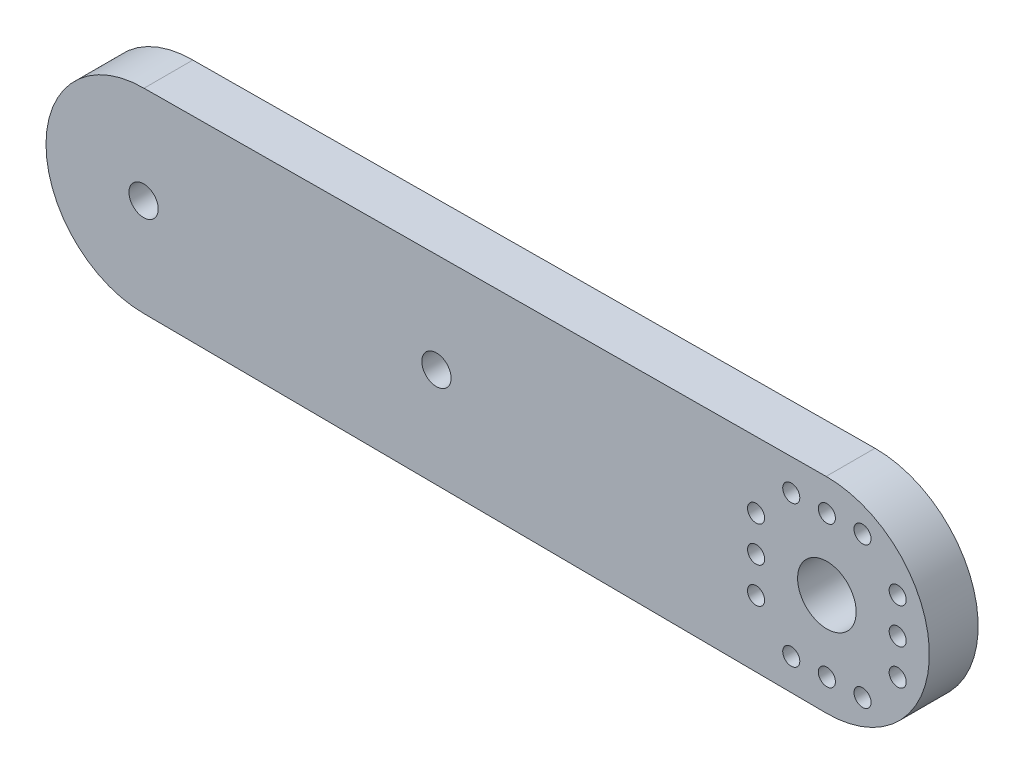
ISO-10303-21;
HEADER;
FILE_DESCRIPTION(('STEP AP214'),'2;1');
FILE_NAME('part.step','',(''),(''),'','','');
FILE_SCHEMA(('AUTOMOTIVE_DESIGN { 1 0 10303 214 1 1 1 1 }'));
ENDSEC;
DATA;
#1=APPLICATION_CONTEXT('core data for automotive mechanical design processes');
#2=APPLICATION_PROTOCOL_DEFINITION('international standard','automotive_design',2000,#1);
#3=PRODUCT_CONTEXT('',#1,'mechanical');
#4=PRODUCT('Part','Part','',(#3));
#5=PRODUCT_RELATED_PRODUCT_CATEGORY('part','',(#4));
#6=PRODUCT_DEFINITION_FORMATION('','',#4);
#7=PRODUCT_DEFINITION_CONTEXT('part definition',#1,'design');
#8=PRODUCT_DEFINITION('design','',#6,#7);
#9=PRODUCT_DEFINITION_SHAPE('','',#8);
#10=(LENGTH_UNIT() NAMED_UNIT(*) SI_UNIT(.MILLI.,.METRE.));
#11=(NAMED_UNIT(*) PLANE_ANGLE_UNIT() SI_UNIT($,.RADIAN.));
#12=(NAMED_UNIT(*) SI_UNIT($,.STERADIAN.) SOLID_ANGLE_UNIT());
#13=UNCERTAINTY_MEASURE_WITH_UNIT(LENGTH_MEASURE(1.E-05),#10,'distance_accuracy_value','');
#14=(GEOMETRIC_REPRESENTATION_CONTEXT(3) GLOBAL_UNCERTAINTY_ASSIGNED_CONTEXT((#13)) GLOBAL_UNIT_ASSIGNED_CONTEXT((#10,
#11,#12)) REPRESENTATION_CONTEXT('',''));
#15=CARTESIAN_POINT('',(0.,0.,0.));
#16=DIRECTION('',(0.,0.,1.));
#17=DIRECTION('',(1.,0.,0.));
#18=AXIS2_PLACEMENT_3D('',#15,#16,#17);
#19=CARTESIAN_POINT('',(-70.,0.,5.));
#20=DIRECTION('',(0.,0.,1.));
#21=DIRECTION('',(1.,0.,0.));
#22=AXIS2_PLACEMENT_3D('',#19,#20,#21);
#23=PLANE('',#22);
#24=CARTESIAN_POINT('',(-40.,0.,5.));
#25=DIRECTION('',(0.,0.,1.));
#26=DIRECTION('',(1.,0.,0.));
#27=AXIS2_PLACEMENT_3D('',#24,#25,#26);
#28=CIRCLE('',#27,1.5);
#29=CARTESIAN_POINT('',(-38.5,0.,5.));
#30=VERTEX_POINT('',#29);
#31=EDGE_CURVE('E188',#30,#30,#28,.T.);
#32=ORIENTED_EDGE('',*,*,#31,.F.);
#33=EDGE_LOOP('',(#32));
#34=FACE_BOUND('',#33,.T.);
#35=CARTESIAN_POINT('',(1.00571845041749E-13,7.2544999999999,5.));
#36=DIRECTION('',(0.,0.,1.));
#37=DIRECTION('',(1.,0.,0.));
#38=AXIS2_PLACEMENT_3D('',#35,#36,#37);
#39=CIRCLE('',#38,0.875000000000108);
#40=CARTESIAN_POINT('',(0.875000000000208,7.2544999999999,5.));
#41=VERTEX_POINT('',#40);
#42=EDGE_CURVE('E176',#41,#41,#39,.T.);
#43=ORIENTED_EDGE('',*,*,#42,.F.);
#44=EDGE_LOOP('',(#43));
#45=FACE_BOUND('',#44,.T.);
#46=CARTESIAN_POINT('',(-7.2544999999998,3.65,5.));
#47=DIRECTION('',(0.,0.,1.));
#48=DIRECTION('',(-1.,0.,0.));
#49=AXIS2_PLACEMENT_3D('',#46,#47,#48);
#50=CIRCLE('',#49,0.875000000000177);
#51=CARTESIAN_POINT('',(-8.12949999999997,3.65,5.));
#52=VERTEX_POINT('',#51);
#53=EDGE_CURVE('E164',#52,#52,#50,.T.);
#54=ORIENTED_EDGE('',*,*,#53,.F.);
#55=EDGE_LOOP('',(#54));
#56=FACE_BOUND('',#55,.T.);
#57=CARTESIAN_POINT('',(-7.2544999999998,-3.65,5.));
#58=DIRECTION('',(0.,0.,1.));
#59=DIRECTION('',(1.,0.,0.));
#60=AXIS2_PLACEMENT_3D('',#57,#58,#59);
#61=CIRCLE('',#60,0.875000000000204);
#62=CARTESIAN_POINT('',(-6.37949999999959,-3.65,5.));
#63=VERTEX_POINT('',#62);
#64=EDGE_CURVE('E152',#63,#63,#61,.T.);
#65=ORIENTED_EDGE('',*,*,#64,.F.);
#66=EDGE_LOOP('',(#65));
#67=FACE_BOUND('',#66,.T.);
#68=CARTESIAN_POINT('',(1.03237105103073E-13,-7.2544999999999,5.));
#69=DIRECTION('',(0.,0.,1.));
#70=DIRECTION('',(1.,0.,0.));
#71=AXIS2_PLACEMENT_3D('',#68,#69,#70);
#72=CIRCLE('',#71,0.87500000000006);
#73=CARTESIAN_POINT('',(0.875000000000164,-7.2544999999999,5.));
#74=VERTEX_POINT('',#73);
#75=EDGE_CURVE('E140',#74,#74,#72,.T.);
#76=ORIENTED_EDGE('',*,*,#75,.F.);
#77=EDGE_LOOP('',(#76));
#78=FACE_BOUND('',#77,.T.);
#79=CARTESIAN_POINT('',(7.2545,-3.65,5.));
#80=DIRECTION('',(0.,0.,1.));
#81=DIRECTION('',(-1.,0.,0.));
#82=AXIS2_PLACEMENT_3D('',#79,#80,#81);
#83=CIRCLE('',#82,0.874999999999995);
#84=CARTESIAN_POINT('',(6.3795,-3.65,5.));
#85=VERTEX_POINT('',#84);
#86=EDGE_CURVE('E128',#85,#85,#83,.T.);
#87=ORIENTED_EDGE('',*,*,#86,.F.);
#88=EDGE_LOOP('',(#87));
#89=FACE_BOUND('',#88,.T.);
#90=CARTESIAN_POINT('',(7.2545,3.65,5.));
#91=DIRECTION('',(0.,0.,1.));
#92=DIRECTION('',(1.,0.,0.));
#93=AXIS2_PLACEMENT_3D('',#90,#91,#92);
#94=CIRCLE('',#93,0.874999999999998);
#95=CARTESIAN_POINT('',(8.1295,3.65,5.));
#96=VERTEX_POINT('',#95);
#97=EDGE_CURVE('E116',#96,#96,#94,.T.);
#98=ORIENTED_EDGE('',*,*,#97,.F.);
#99=EDGE_LOOP('',(#98));
#100=FACE_BOUND('',#99,.T.);
#101=CARTESIAN_POINT('',(-70.,0.,5.));
#102=DIRECTION('',(0.,0.,1.));
#103=DIRECTION('',(1.,0.,0.));
#104=AXIS2_PLACEMENT_3D('',#101,#102,#103);
#105=CIRCLE('',#104,10.);
#106=CARTESIAN_POINT('',(-69.9571642528192,9.9999082545173,5.));
#107=VERTEX_POINT('',#106);
#108=CARTESIAN_POINT('',(-70.,-10.,5.));
#109=VERTEX_POINT('',#108);
#110=EDGE_CURVE('E86',#107,#109,#105,.T.);
#111=ORIENTED_EDGE('',*,*,#110,.T.);
#112=DIRECTION('',(0.999974463405456,-0.00714650522779189,0.));
#113=VECTOR('',#112,1.);
#114=CARTESIAN_POINT('',(-70.,-10.,5.));
#115=LINE('',#114,#113);
#116=CARTESIAN_POINT('',(-0.0750383048918187,-10.4997318657573,5.));
#117=VERTEX_POINT('',#116);
#118=EDGE_CURVE('E81',#109,#117,#115,.T.);
#119=ORIENTED_EDGE('',*,*,#118,.T.);
#120=CARTESIAN_POINT('',(0.,0.,5.));
#121=DIRECTION('',(0.,0.,1.));
#122=DIRECTION('',(1.,0.,0.));
#123=AXIS2_PLACEMENT_3D('',#120,#121,#122);
#124=CIRCLE('',#123,10.5);
#125=CARTESIAN_POINT('',(-0.0750980828813749,10.4997314383725,5.));
#126=VERTEX_POINT('',#125);
#127=EDGE_CURVE('E84',#117,#126,#124,.T.);
#128=ORIENTED_EDGE('',*,*,#127,.T.);
#129=DIRECTION('',(-0.999974422702141,-0.00715219836965465,0.));
#130=VECTOR('',#129,1.);
#131=CARTESIAN_POINT('',(-69.9571642528192,9.9999082545173,5.));
#132=LINE('',#131,#130);
#133=EDGE_CURVE('E51',#126,#107,#132,.T.);
#134=ORIENTED_EDGE('',*,*,#133,.T.);
#135=EDGE_LOOP('',(#111,#119,#128,#134));
#136=FACE_BOUND('',#135,.T.);
#137=CARTESIAN_POINT('',(-70.,0.,5.));
#138=DIRECTION('',(0.,0.,1.));
#139=DIRECTION('',(1.,0.,0.));
#140=AXIS2_PLACEMENT_3D('',#137,#138,#139);
#141=CIRCLE('',#140,1.5);
#142=CARTESIAN_POINT('',(-68.5,0.,5.));
#143=VERTEX_POINT('',#142);
#144=EDGE_CURVE('E101',#143,#143,#141,.T.);
#145=ORIENTED_EDGE('',*,*,#144,.F.);
#146=EDGE_LOOP('',(#145));
#147=FACE_BOUND('',#146,.T.);
#148=CARTESIAN_POINT('',(7.2545,0.,5.));
#149=DIRECTION('',(0.,0.,1.));
#150=DIRECTION('',(1.,0.,0.));
#151=AXIS2_PLACEMENT_3D('',#148,#149,#150);
#152=CIRCLE('',#151,0.875);
#153=CARTESIAN_POINT('',(8.1295,0.,5.));
#154=VERTEX_POINT('',#153);
#155=EDGE_CURVE('E122',#154,#154,#152,.T.);
#156=ORIENTED_EDGE('',*,*,#155,.F.);
#157=EDGE_LOOP('',(#156));
#158=FACE_BOUND('',#157,.T.);
#159=CARTESIAN_POINT('',(3.6500000000001,-7.2544999999999,5.));
#160=DIRECTION('',(0.,0.,1.));
#161=DIRECTION('',(1.,0.,0.));
#162=AXIS2_PLACEMENT_3D('',#159,#160,#161);
#163=CIRCLE('',#162,0.875000000000071);
#164=CARTESIAN_POINT('',(4.52500000000017,-7.2544999999999,5.));
#165=VERTEX_POINT('',#164);
#166=EDGE_CURVE('E134',#165,#165,#163,.T.);
#167=ORIENTED_EDGE('',*,*,#166,.F.);
#168=EDGE_LOOP('',(#167));
#169=FACE_BOUND('',#168,.T.);
#170=CARTESIAN_POINT('',(-3.6499999999999,-7.2544999999999,5.));
#171=DIRECTION('',(0.,0.,1.));
#172=DIRECTION('',(-1.,0.,0.));
#173=AXIS2_PLACEMENT_3D('',#170,#171,#172);
#174=CIRCLE('',#173,0.875000000000114);
#175=CARTESIAN_POINT('',(-4.52500000000001,-7.2544999999999,5.));
#176=VERTEX_POINT('',#175);
#177=EDGE_CURVE('E146',#176,#176,#174,.T.);
#178=ORIENTED_EDGE('',*,*,#177,.F.);
#179=EDGE_LOOP('',(#178));
#180=FACE_BOUND('',#179,.T.);
#181=CARTESIAN_POINT('',(-7.2544999999998,0.,5.));
#182=DIRECTION('',(0.,0.,1.));
#183=DIRECTION('',(1.,0.,0.));
#184=AXIS2_PLACEMENT_3D('',#181,#182,#183);
#185=CIRCLE('',#184,0.875000000000181);
#186=CARTESIAN_POINT('',(-6.37949999999961,0.,5.));
#187=VERTEX_POINT('',#186);
#188=EDGE_CURVE('E158',#187,#187,#185,.T.);
#189=ORIENTED_EDGE('',*,*,#188,.F.);
#190=EDGE_LOOP('',(#189));
#191=FACE_BOUND('',#190,.T.);
#192=CARTESIAN_POINT('',(-3.6499999999999,7.2544999999999,5.));
#193=DIRECTION('',(0.,0.,1.));
#194=DIRECTION('',(1.,0.,0.));
#195=AXIS2_PLACEMENT_3D('',#192,#193,#194);
#196=CIRCLE('',#195,0.875000000000142);
#197=CARTESIAN_POINT('',(-2.77499999999976,7.2544999999999,5.));
#198=VERTEX_POINT('',#197);
#199=EDGE_CURVE('E170',#198,#198,#196,.T.);
#200=ORIENTED_EDGE('',*,*,#199,.F.);
#201=EDGE_LOOP('',(#200));
#202=FACE_BOUND('',#201,.T.);
#203=CARTESIAN_POINT('',(3.6500000000001,7.2544999999999,5.));
#204=DIRECTION('',(0.,0.,1.));
#205=DIRECTION('',(-1.,0.,0.));
#206=AXIS2_PLACEMENT_3D('',#203,#204,#205);
#207=CIRCLE('',#206,0.875000000000044);
#208=CARTESIAN_POINT('',(2.77500000000006,7.2544999999999,5.));
#209=VERTEX_POINT('',#208);
#210=EDGE_CURVE('E182',#209,#209,#207,.T.);
#211=ORIENTED_EDGE('',*,*,#210,.F.);
#212=EDGE_LOOP('',(#211));
#213=FACE_BOUND('',#212,.T.);
#214=CARTESIAN_POINT('',(0.,0.,5.));
#215=DIRECTION('',(0.,0.,1.));
#216=DIRECTION('',(1.,0.,0.));
#217=AXIS2_PLACEMENT_3D('',#214,#215,#216);
#218=CIRCLE('',#217,3.);
#219=CARTESIAN_POINT('',(3.,0.,5.));
#220=VERTEX_POINT('',#219);
#221=EDGE_CURVE('E194',#220,#220,#218,.T.);
#222=ORIENTED_EDGE('',*,*,#221,.F.);
#223=EDGE_LOOP('',(#222));
#224=FACE_BOUND('',#223,.T.);
#225=ADVANCED_FACE('F34',(#34,#45,#56,#67,#78,#89,#100,#136,#147,#158,#169,#180,#191,#202,#213,
#224),#23,.T.);
#226=CARTESIAN_POINT('',(-70.,0.,0.));
#227=DIRECTION('',(0.,0.,1.));
#228=DIRECTION('',(1.,0.,0.));
#229=AXIS2_PLACEMENT_3D('',#226,#227,#228);
#230=PLANE('',#229);
#231=CARTESIAN_POINT('',(-40.,0.,0.));
#232=DIRECTION('',(0.,0.,1.));
#233=DIRECTION('',(1.,0.,0.));
#234=AXIS2_PLACEMENT_3D('',#231,#232,#233);
#235=CIRCLE('',#234,1.5);
#236=CARTESIAN_POINT('',(-38.5,0.,0.));
#237=VERTEX_POINT('',#236);
#238=EDGE_CURVE('E191',#237,#237,#235,.T.);
#239=ORIENTED_EDGE('',*,*,#238,.T.);
#240=EDGE_LOOP('',(#239));
#241=FACE_BOUND('',#240,.T.);
#242=CARTESIAN_POINT('',(1.00571845041749E-13,7.2544999999999,0.));
#243=DIRECTION('',(0.,0.,1.));
#244=DIRECTION('',(1.,0.,0.));
#245=AXIS2_PLACEMENT_3D('',#242,#243,#244);
#246=CIRCLE('',#245,0.875000000000108);
#247=CARTESIAN_POINT('',(0.875000000000208,7.2544999999999,0.));
#248=VERTEX_POINT('',#247);
#249=EDGE_CURVE('E179',#248,#248,#246,.T.);
#250=ORIENTED_EDGE('',*,*,#249,.T.);
#251=EDGE_LOOP('',(#250));
#252=FACE_BOUND('',#251,.T.);
#253=CARTESIAN_POINT('',(-7.2544999999998,3.65,0.));
#254=DIRECTION('',(0.,0.,1.));
#255=DIRECTION('',(-1.,0.,0.));
#256=AXIS2_PLACEMENT_3D('',#253,#254,#255);
#257=CIRCLE('',#256,0.875000000000177);
#258=CARTESIAN_POINT('',(-8.12949999999997,3.65,0.));
#259=VERTEX_POINT('',#258);
#260=EDGE_CURVE('E167',#259,#259,#257,.T.);
#261=ORIENTED_EDGE('',*,*,#260,.T.);
#262=EDGE_LOOP('',(#261));
#263=FACE_BOUND('',#262,.T.);
#264=CARTESIAN_POINT('',(-7.2544999999998,-3.65,0.));
#265=DIRECTION('',(0.,0.,1.));
#266=DIRECTION('',(1.,0.,0.));
#267=AXIS2_PLACEMENT_3D('',#264,#265,#266);
#268=CIRCLE('',#267,0.875000000000204);
#269=CARTESIAN_POINT('',(-6.37949999999959,-3.65,0.));
#270=VERTEX_POINT('',#269);
#271=EDGE_CURVE('E155',#270,#270,#268,.T.);
#272=ORIENTED_EDGE('',*,*,#271,.T.);
#273=EDGE_LOOP('',(#272));
#274=FACE_BOUND('',#273,.T.);
#275=CARTESIAN_POINT('',(1.03237105103073E-13,-7.2544999999999,0.));
#276=DIRECTION('',(0.,0.,1.));
#277=DIRECTION('',(1.,0.,0.));
#278=AXIS2_PLACEMENT_3D('',#275,#276,#277);
#279=CIRCLE('',#278,0.87500000000006);
#280=CARTESIAN_POINT('',(0.875000000000164,-7.2544999999999,0.));
#281=VERTEX_POINT('',#280);
#282=EDGE_CURVE('E143',#281,#281,#279,.T.);
#283=ORIENTED_EDGE('',*,*,#282,.T.);
#284=EDGE_LOOP('',(#283));
#285=FACE_BOUND('',#284,.T.);
#286=CARTESIAN_POINT('',(7.2545,-3.65,0.));
#287=DIRECTION('',(0.,0.,1.));
#288=DIRECTION('',(-1.,0.,0.));
#289=AXIS2_PLACEMENT_3D('',#286,#287,#288);
#290=CIRCLE('',#289,0.874999999999995);
#291=CARTESIAN_POINT('',(6.3795,-3.65,0.));
#292=VERTEX_POINT('',#291);
#293=EDGE_CURVE('E131',#292,#292,#290,.T.);
#294=ORIENTED_EDGE('',*,*,#293,.T.);
#295=EDGE_LOOP('',(#294));
#296=FACE_BOUND('',#295,.T.);
#297=CARTESIAN_POINT('',(7.2545,3.65,0.));
#298=DIRECTION('',(0.,0.,1.));
#299=DIRECTION('',(1.,0.,0.));
#300=AXIS2_PLACEMENT_3D('',#297,#298,#299);
#301=CIRCLE('',#300,0.874999999999998);
#302=CARTESIAN_POINT('',(8.1295,3.65,0.));
#303=VERTEX_POINT('',#302);
#304=EDGE_CURVE('E119',#303,#303,#301,.T.);
#305=ORIENTED_EDGE('',*,*,#304,.T.);
#306=EDGE_LOOP('',(#305));
#307=FACE_BOUND('',#306,.T.);
#308=CARTESIAN_POINT('',(-70.,0.,0.));
#309=DIRECTION('',(0.,0.,1.));
#310=DIRECTION('',(1.,0.,0.));
#311=AXIS2_PLACEMENT_3D('',#308,#309,#310);
#312=CIRCLE('',#311,10.);
#313=CARTESIAN_POINT('',(-69.9571642528192,9.9999082545173,0.));
#314=VERTEX_POINT('',#313);
#315=CARTESIAN_POINT('',(-70.,-10.,0.));
#316=VERTEX_POINT('',#315);
#317=EDGE_CURVE('E98',#314,#316,#312,.T.);
#318=ORIENTED_EDGE('',*,*,#317,.F.);
#319=DIRECTION('',(-0.999974422702141,-0.00715219836965465,0.));
#320=VECTOR('',#319,1.);
#321=CARTESIAN_POINT('',(-69.9571642528192,9.9999082545173,0.));
#322=LINE('',#321,#320);
#323=CARTESIAN_POINT('',(-0.0750980828813749,10.4997314383725,0.));
#324=VERTEX_POINT('',#323);
#325=EDGE_CURVE('E74',#324,#314,#322,.T.);
#326=ORIENTED_EDGE('',*,*,#325,.F.);
#327=CARTESIAN_POINT('',(0.,0.,0.));
#328=DIRECTION('',(0.,0.,1.));
#329=DIRECTION('',(1.,0.,0.));
#330=AXIS2_PLACEMENT_3D('',#327,#328,#329);
#331=CIRCLE('',#330,10.5);
#332=CARTESIAN_POINT('',(-0.0750383048918187,-10.4997318657573,0.));
#333=VERTEX_POINT('',#332);
#334=EDGE_CURVE('E68',#333,#324,#331,.T.);
#335=ORIENTED_EDGE('',*,*,#334,.F.);
#336=DIRECTION('',(0.999974463405456,-0.00714650522779189,0.));
#337=VECTOR('',#336,1.);
#338=CARTESIAN_POINT('',(-70.,-10.,0.));
#339=LINE('',#338,#337);
#340=EDGE_CURVE('E90',#316,#333,#339,.T.);
#341=ORIENTED_EDGE('',*,*,#340,.F.);
#342=EDGE_LOOP('',(#318,#326,#335,#341));
#343=FACE_BOUND('',#342,.T.);
#344=CARTESIAN_POINT('',(-70.,0.,0.));
#345=DIRECTION('',(0.,0.,1.));
#346=DIRECTION('',(1.,0.,0.));
#347=AXIS2_PLACEMENT_3D('',#344,#345,#346);
#348=CIRCLE('',#347,1.5);
#349=CARTESIAN_POINT('',(-68.5,0.,0.));
#350=VERTEX_POINT('',#349);
#351=EDGE_CURVE('E113',#350,#350,#348,.T.);
#352=ORIENTED_EDGE('',*,*,#351,.T.);
#353=EDGE_LOOP('',(#352));
#354=FACE_BOUND('',#353,.T.);
#355=CARTESIAN_POINT('',(7.2545,0.,0.));
#356=DIRECTION('',(0.,0.,1.));
#357=DIRECTION('',(1.,0.,0.));
#358=AXIS2_PLACEMENT_3D('',#355,#356,#357);
#359=CIRCLE('',#358,0.875);
#360=CARTESIAN_POINT('',(8.1295,0.,0.));
#361=VERTEX_POINT('',#360);
#362=EDGE_CURVE('E125',#361,#361,#359,.T.);
#363=ORIENTED_EDGE('',*,*,#362,.T.);
#364=EDGE_LOOP('',(#363));
#365=FACE_BOUND('',#364,.T.);
#366=CARTESIAN_POINT('',(3.6500000000001,-7.2544999999999,0.));
#367=DIRECTION('',(0.,0.,1.));
#368=DIRECTION('',(1.,0.,0.));
#369=AXIS2_PLACEMENT_3D('',#366,#367,#368);
#370=CIRCLE('',#369,0.875000000000071);
#371=CARTESIAN_POINT('',(4.52500000000017,-7.2544999999999,0.));
#372=VERTEX_POINT('',#371);
#373=EDGE_CURVE('E137',#372,#372,#370,.T.);
#374=ORIENTED_EDGE('',*,*,#373,.T.);
#375=EDGE_LOOP('',(#374));
#376=FACE_BOUND('',#375,.T.);
#377=CARTESIAN_POINT('',(-3.6499999999999,-7.2544999999999,0.));
#378=DIRECTION('',(0.,0.,1.));
#379=DIRECTION('',(-1.,0.,0.));
#380=AXIS2_PLACEMENT_3D('',#377,#378,#379);
#381=CIRCLE('',#380,0.875000000000114);
#382=CARTESIAN_POINT('',(-4.52500000000001,-7.2544999999999,0.));
#383=VERTEX_POINT('',#382);
#384=EDGE_CURVE('E149',#383,#383,#381,.T.);
#385=ORIENTED_EDGE('',*,*,#384,.T.);
#386=EDGE_LOOP('',(#385));
#387=FACE_BOUND('',#386,.T.);
#388=CARTESIAN_POINT('',(-7.2544999999998,0.,0.));
#389=DIRECTION('',(0.,0.,1.));
#390=DIRECTION('',(1.,0.,0.));
#391=AXIS2_PLACEMENT_3D('',#388,#389,#390);
#392=CIRCLE('',#391,0.875000000000181);
#393=CARTESIAN_POINT('',(-6.37949999999961,0.,0.));
#394=VERTEX_POINT('',#393);
#395=EDGE_CURVE('E161',#394,#394,#392,.T.);
#396=ORIENTED_EDGE('',*,*,#395,.T.);
#397=EDGE_LOOP('',(#396));
#398=FACE_BOUND('',#397,.T.);
#399=CARTESIAN_POINT('',(-3.6499999999999,7.2544999999999,0.));
#400=DIRECTION('',(0.,0.,1.));
#401=DIRECTION('',(1.,0.,0.));
#402=AXIS2_PLACEMENT_3D('',#399,#400,#401);
#403=CIRCLE('',#402,0.875000000000142);
#404=CARTESIAN_POINT('',(-2.77499999999976,7.2544999999999,0.));
#405=VERTEX_POINT('',#404);
#406=EDGE_CURVE('E173',#405,#405,#403,.T.);
#407=ORIENTED_EDGE('',*,*,#406,.T.);
#408=EDGE_LOOP('',(#407));
#409=FACE_BOUND('',#408,.T.);
#410=CARTESIAN_POINT('',(3.6500000000001,7.2544999999999,0.));
#411=DIRECTION('',(0.,0.,1.));
#412=DIRECTION('',(-1.,0.,0.));
#413=AXIS2_PLACEMENT_3D('',#410,#411,#412);
#414=CIRCLE('',#413,0.875000000000044);
#415=CARTESIAN_POINT('',(2.77500000000006,7.2544999999999,0.));
#416=VERTEX_POINT('',#415);
#417=EDGE_CURVE('E185',#416,#416,#414,.T.);
#418=ORIENTED_EDGE('',*,*,#417,.T.);
#419=EDGE_LOOP('',(#418));
#420=FACE_BOUND('',#419,.T.);
#421=CARTESIAN_POINT('',(0.,0.,0.));
#422=DIRECTION('',(0.,0.,1.));
#423=DIRECTION('',(1.,0.,0.));
#424=AXIS2_PLACEMENT_3D('',#421,#422,#423);
#425=CIRCLE('',#424,3.);
#426=CARTESIAN_POINT('',(3.,0.,0.));
#427=VERTEX_POINT('',#426);
#428=EDGE_CURVE('E197',#427,#427,#425,.T.);
#429=ORIENTED_EDGE('',*,*,#428,.T.);
#430=EDGE_LOOP('',(#429));
#431=FACE_BOUND('',#430,.T.);
#432=ADVANCED_FACE('F109',(#241,#252,#263,#274,#285,#296,#307,#343,#354,#365,#376,#387,#398,
#409,#420,#431),#230,.F.);
#433=CARTESIAN_POINT('',(-70.,0.,5.));
#434=DIRECTION('',(0.,0.,-1.));
#435=DIRECTION('',(-1.,0.,0.));
#436=AXIS2_PLACEMENT_3D('',#433,#434,#435);
#437=CYLINDRICAL_SURFACE('',#436,10.);
#438=ORIENTED_EDGE('',*,*,#317,.T.);
#439=DIRECTION('',(0.,0.,-1.));
#440=VECTOR('',#439,1.);
#441=CARTESIAN_POINT('',(-70.,-10.,5.));
#442=LINE('',#441,#440);
#443=EDGE_CURVE('E11',#109,#316,#442,.T.);
#444=ORIENTED_EDGE('',*,*,#443,.F.);
#445=ORIENTED_EDGE('',*,*,#110,.F.);
#446=DIRECTION('',(0.,0.,-1.));
#447=VECTOR('',#446,1.);
#448=CARTESIAN_POINT('',(-69.9571642528192,9.9999082545173,5.));
#449=LINE('',#448,#447);
#450=EDGE_CURVE('E94',#107,#314,#449,.T.);
#451=ORIENTED_EDGE('',*,*,#450,.T.);
#452=EDGE_LOOP('',(#438,#444,#445,#451));
#453=FACE_BOUND('',#452,.T.);
#454=ADVANCED_FACE('F36',(#453),#437,.T.);
#455=CARTESIAN_POINT('',(-70.,-10.,5.));
#456=DIRECTION('',(0.00714650522779189,0.999974463405456,0.));
#457=DIRECTION('',(-0.999974463405456,0.00714650522779189,0.));
#458=AXIS2_PLACEMENT_3D('',#455,#456,#457);
#459=PLANE('',#458);
#460=ORIENTED_EDGE('',*,*,#340,.T.);
#461=DIRECTION('',(0.,0.,-1.));
#462=VECTOR('',#461,1.);
#463=CARTESIAN_POINT('',(-0.0750383048918187,-10.4997318657573,5.));
#464=LINE('',#463,#462);
#465=EDGE_CURVE('E43',#117,#333,#464,.T.);
#466=ORIENTED_EDGE('',*,*,#465,.F.);
#467=ORIENTED_EDGE('',*,*,#118,.F.);
#468=ORIENTED_EDGE('',*,*,#443,.T.);
#469=EDGE_LOOP('',(#460,#466,#467,#468));
#470=FACE_BOUND('',#469,.T.);
#471=ADVANCED_FACE('F89',(#470),#459,.F.);
#472=CARTESIAN_POINT('',(0.,0.,5.));
#473=DIRECTION('',(0.,0.,-1.));
#474=DIRECTION('',(-1.,0.,0.));
#475=AXIS2_PLACEMENT_3D('',#472,#473,#474);
#476=CYLINDRICAL_SURFACE('',#475,10.5);
#477=ORIENTED_EDGE('',*,*,#334,.T.);
#478=DIRECTION('',(0.,0.,-1.));
#479=VECTOR('',#478,1.);
#480=CARTESIAN_POINT('',(-0.0750980828813749,10.4997314383725,5.));
#481=LINE('',#480,#479);
#482=EDGE_CURVE('E91',#126,#324,#481,.T.);
#483=ORIENTED_EDGE('',*,*,#482,.F.);
#484=ORIENTED_EDGE('',*,*,#127,.F.);
#485=ORIENTED_EDGE('',*,*,#465,.T.);
#486=EDGE_LOOP('',(#477,#483,#484,#485));
#487=FACE_BOUND('',#486,.T.);
#488=ADVANCED_FACE('F92',(#487),#476,.T.);
#489=CARTESIAN_POINT('',(-69.9571642528192,9.9999082545173,5.));
#490=DIRECTION('',(0.00715219836965465,-0.999974422702142,0.));
#491=DIRECTION('',(0.999974422702142,0.00715219836965465,0.));
#492=AXIS2_PLACEMENT_3D('',#489,#490,#491);
#493=PLANE('',#492);
#494=ORIENTED_EDGE('',*,*,#325,.T.);
#495=ORIENTED_EDGE('',*,*,#450,.F.);
#496=ORIENTED_EDGE('',*,*,#133,.F.);
#497=ORIENTED_EDGE('',*,*,#482,.T.);
#498=EDGE_LOOP('',(#494,#495,#496,#497));
#499=FACE_BOUND('',#498,.T.);
#500=ADVANCED_FACE('F106',(#499),#493,.F.);
#501=CARTESIAN_POINT('',(-70.,0.,5.));
#502=DIRECTION('',(0.,0.,-1.));
#503=DIRECTION('',(-1.,0.,0.));
#504=AXIS2_PLACEMENT_3D('',#501,#502,#503);
#505=CYLINDRICAL_SURFACE('',#504,1.5);
#506=ORIENTED_EDGE('',*,*,#144,.T.);
#507=EDGE_LOOP('',(#506));
#508=FACE_BOUND('',#507,.T.);
#509=ORIENTED_EDGE('',*,*,#351,.F.);
#510=EDGE_LOOP('',(#509));
#511=FACE_BOUND('',#510,.T.);
#512=ADVANCED_FACE('F217',(#508,#511),#505,.F.);
#513=CARTESIAN_POINT('',(7.2545,3.65,5.));
#514=DIRECTION('',(0.,0.,-1.));
#515=DIRECTION('',(-1.,0.,0.));
#516=AXIS2_PLACEMENT_3D('',#513,#514,#515);
#517=CYLINDRICAL_SURFACE('',#516,0.874999999999998);
#518=ORIENTED_EDGE('',*,*,#97,.T.);
#519=EDGE_LOOP('',(#518));
#520=FACE_BOUND('',#519,.T.);
#521=ORIENTED_EDGE('',*,*,#304,.F.);
#522=EDGE_LOOP('',(#521));
#523=FACE_BOUND('',#522,.T.);
#524=ADVANCED_FACE('F264',(#520,#523),#517,.F.);
#525=CARTESIAN_POINT('',(7.2545,0.,5.));
#526=DIRECTION('',(0.,0.,-1.));
#527=DIRECTION('',(-1.,0.,0.));
#528=AXIS2_PLACEMENT_3D('',#525,#526,#527);
#529=CYLINDRICAL_SURFACE('',#528,0.875);
#530=ORIENTED_EDGE('',*,*,#155,.T.);
#531=EDGE_LOOP('',(#530));
#532=FACE_BOUND('',#531,.T.);
#533=ORIENTED_EDGE('',*,*,#362,.F.);
#534=EDGE_LOOP('',(#533));
#535=FACE_BOUND('',#534,.T.);
#536=ADVANCED_FACE('F273',(#532,#535),#529,.F.);
#537=CARTESIAN_POINT('',(7.2545,-3.65,5.));
#538=DIRECTION('',(0.,0.,-1.));
#539=DIRECTION('',(-1.,0.,0.));
#540=AXIS2_PLACEMENT_3D('',#537,#538,#539);
#541=CYLINDRICAL_SURFACE('',#540,0.874999999999995);
#542=ORIENTED_EDGE('',*,*,#86,.T.);
#543=EDGE_LOOP('',(#542));
#544=FACE_BOUND('',#543,.T.);
#545=ORIENTED_EDGE('',*,*,#293,.F.);
#546=EDGE_LOOP('',(#545));
#547=FACE_BOUND('',#546,.T.);
#548=ADVANCED_FACE('F282',(#544,#547),#541,.F.);
#549=CARTESIAN_POINT('',(3.6500000000001,-7.2544999999999,5.));
#550=DIRECTION('',(0.,0.,-1.));
#551=DIRECTION('',(-1.,0.,0.));
#552=AXIS2_PLACEMENT_3D('',#549,#550,#551);
#553=CYLINDRICAL_SURFACE('',#552,0.875000000000071);
#554=ORIENTED_EDGE('',*,*,#166,.T.);
#555=EDGE_LOOP('',(#554));
#556=FACE_BOUND('',#555,.T.);
#557=ORIENTED_EDGE('',*,*,#373,.F.);
#558=EDGE_LOOP('',(#557));
#559=FACE_BOUND('',#558,.T.);
#560=ADVANCED_FACE('F292',(#556,#559),#553,.F.);
#561=CARTESIAN_POINT('',(1.03237105103073E-13,-7.2544999999999,5.));
#562=DIRECTION('',(0.,0.,-1.));
#563=DIRECTION('',(-1.,0.,0.));
#564=AXIS2_PLACEMENT_3D('',#561,#562,#563);
#565=CYLINDRICAL_SURFACE('',#564,0.87500000000006);
#566=ORIENTED_EDGE('',*,*,#75,.T.);
#567=EDGE_LOOP('',(#566));
#568=FACE_BOUND('',#567,.T.);
#569=ORIENTED_EDGE('',*,*,#282,.F.);
#570=EDGE_LOOP('',(#569));
#571=FACE_BOUND('',#570,.T.);
#572=ADVANCED_FACE('F302',(#568,#571),#565,.F.);
#573=CARTESIAN_POINT('',(-3.6499999999999,-7.2544999999999,5.));
#574=DIRECTION('',(0.,0.,-1.));
#575=DIRECTION('',(-1.,0.,0.));
#576=AXIS2_PLACEMENT_3D('',#573,#574,#575);
#577=CYLINDRICAL_SURFACE('',#576,0.875000000000114);
#578=ORIENTED_EDGE('',*,*,#177,.T.);
#579=EDGE_LOOP('',(#578));
#580=FACE_BOUND('',#579,.T.);
#581=ORIENTED_EDGE('',*,*,#384,.F.);
#582=EDGE_LOOP('',(#581));
#583=FACE_BOUND('',#582,.T.);
#584=ADVANCED_FACE('F312',(#580,#583),#577,.F.);
#585=CARTESIAN_POINT('',(-7.2544999999998,-3.65,5.));
#586=DIRECTION('',(0.,0.,-1.));
#587=DIRECTION('',(-1.,0.,0.));
#588=AXIS2_PLACEMENT_3D('',#585,#586,#587);
#589=CYLINDRICAL_SURFACE('',#588,0.875000000000204);
#590=ORIENTED_EDGE('',*,*,#64,.T.);
#591=EDGE_LOOP('',(#590));
#592=FACE_BOUND('',#591,.T.);
#593=ORIENTED_EDGE('',*,*,#271,.F.);
#594=EDGE_LOOP('',(#593));
#595=FACE_BOUND('',#594,.T.);
#596=ADVANCED_FACE('F322',(#592,#595),#589,.F.);
#597=CARTESIAN_POINT('',(-7.2544999999998,0.,5.));
#598=DIRECTION('',(0.,0.,-1.));
#599=DIRECTION('',(-1.,0.,0.));
#600=AXIS2_PLACEMENT_3D('',#597,#598,#599);
#601=CYLINDRICAL_SURFACE('',#600,0.875000000000181);
#602=ORIENTED_EDGE('',*,*,#188,.T.);
#603=EDGE_LOOP('',(#602));
#604=FACE_BOUND('',#603,.T.);
#605=ORIENTED_EDGE('',*,*,#395,.F.);
#606=EDGE_LOOP('',(#605));
#607=FACE_BOUND('',#606,.T.);
#608=ADVANCED_FACE('F332',(#604,#607),#601,.F.);
#609=CARTESIAN_POINT('',(-7.2544999999998,3.65,5.));
#610=DIRECTION('',(0.,0.,-1.));
#611=DIRECTION('',(-1.,0.,0.));
#612=AXIS2_PLACEMENT_3D('',#609,#610,#611);
#613=CYLINDRICAL_SURFACE('',#612,0.875000000000177);
#614=ORIENTED_EDGE('',*,*,#53,.T.);
#615=EDGE_LOOP('',(#614));
#616=FACE_BOUND('',#615,.T.);
#617=ORIENTED_EDGE('',*,*,#260,.F.);
#618=EDGE_LOOP('',(#617));
#619=FACE_BOUND('',#618,.T.);
#620=ADVANCED_FACE('F342',(#616,#619),#613,.F.);
#621=CARTESIAN_POINT('',(-3.6499999999999,7.2544999999999,5.));
#622=DIRECTION('',(0.,0.,-1.));
#623=DIRECTION('',(-1.,0.,0.));
#624=AXIS2_PLACEMENT_3D('',#621,#622,#623);
#625=CYLINDRICAL_SURFACE('',#624,0.875000000000142);
#626=ORIENTED_EDGE('',*,*,#199,.T.);
#627=EDGE_LOOP('',(#626));
#628=FACE_BOUND('',#627,.T.);
#629=ORIENTED_EDGE('',*,*,#406,.F.);
#630=EDGE_LOOP('',(#629));
#631=FACE_BOUND('',#630,.T.);
#632=ADVANCED_FACE('F352',(#628,#631),#625,.F.);
#633=CARTESIAN_POINT('',(1.00571845041749E-13,7.2544999999999,5.));
#634=DIRECTION('',(0.,0.,-1.));
#635=DIRECTION('',(-1.,0.,0.));
#636=AXIS2_PLACEMENT_3D('',#633,#634,#635);
#637=CYLINDRICAL_SURFACE('',#636,0.875000000000108);
#638=ORIENTED_EDGE('',*,*,#42,.T.);
#639=EDGE_LOOP('',(#638));
#640=FACE_BOUND('',#639,.T.);
#641=ORIENTED_EDGE('',*,*,#249,.F.);
#642=EDGE_LOOP('',(#641));
#643=FACE_BOUND('',#642,.T.);
#644=ADVANCED_FACE('F362',(#640,#643),#637,.F.);
#645=CARTESIAN_POINT('',(3.6500000000001,7.2544999999999,5.));
#646=DIRECTION('',(0.,0.,-1.));
#647=DIRECTION('',(-1.,0.,0.));
#648=AXIS2_PLACEMENT_3D('',#645,#646,#647);
#649=CYLINDRICAL_SURFACE('',#648,0.875000000000044);
#650=ORIENTED_EDGE('',*,*,#210,.T.);
#651=EDGE_LOOP('',(#650));
#652=FACE_BOUND('',#651,.T.);
#653=ORIENTED_EDGE('',*,*,#417,.F.);
#654=EDGE_LOOP('',(#653));
#655=FACE_BOUND('',#654,.T.);
#656=ADVANCED_FACE('F372',(#652,#655),#649,.F.);
#657=CARTESIAN_POINT('',(-40.,0.,5.));
#658=DIRECTION('',(0.,0.,-1.));
#659=DIRECTION('',(-1.,0.,0.));
#660=AXIS2_PLACEMENT_3D('',#657,#658,#659);
#661=CYLINDRICAL_SURFACE('',#660,1.5);
#662=ORIENTED_EDGE('',*,*,#31,.T.);
#663=EDGE_LOOP('',(#662));
#664=FACE_BOUND('',#663,.T.);
#665=ORIENTED_EDGE('',*,*,#238,.F.);
#666=EDGE_LOOP('',(#665));
#667=FACE_BOUND('',#666,.T.);
#668=ADVANCED_FACE('F382',(#664,#667),#661,.F.);
#669=CARTESIAN_POINT('',(0.,0.,5.));
#670=DIRECTION('',(0.,0.,-1.));
#671=DIRECTION('',(-1.,0.,0.));
#672=AXIS2_PLACEMENT_3D('',#669,#670,#671);
#673=CYLINDRICAL_SURFACE('',#672,3.);
#674=ORIENTED_EDGE('',*,*,#221,.T.);
#675=EDGE_LOOP('',(#674));
#676=FACE_BOUND('',#675,.T.);
#677=ORIENTED_EDGE('',*,*,#428,.F.);
#678=EDGE_LOOP('',(#677));
#679=FACE_BOUND('',#678,.T.);
#680=ADVANCED_FACE('F203',(#676,#679),#673,.F.);
#681=CLOSED_SHELL('',(#225,#432,#454,#471,#488,#500,#512,#524,#536,#548,#560,#572,#584,#596,
#608,#620,#632,#644,#656,#668,#680));
#682=MANIFOLD_SOLID_BREP('B2',#681);
#683=ADVANCED_BREP_SHAPE_REPRESENTATION('',(#18,#682),#14);
#684=SHAPE_DEFINITION_REPRESENTATION(#9,#683);
ENDSEC;
END-ISO-10303-21;
